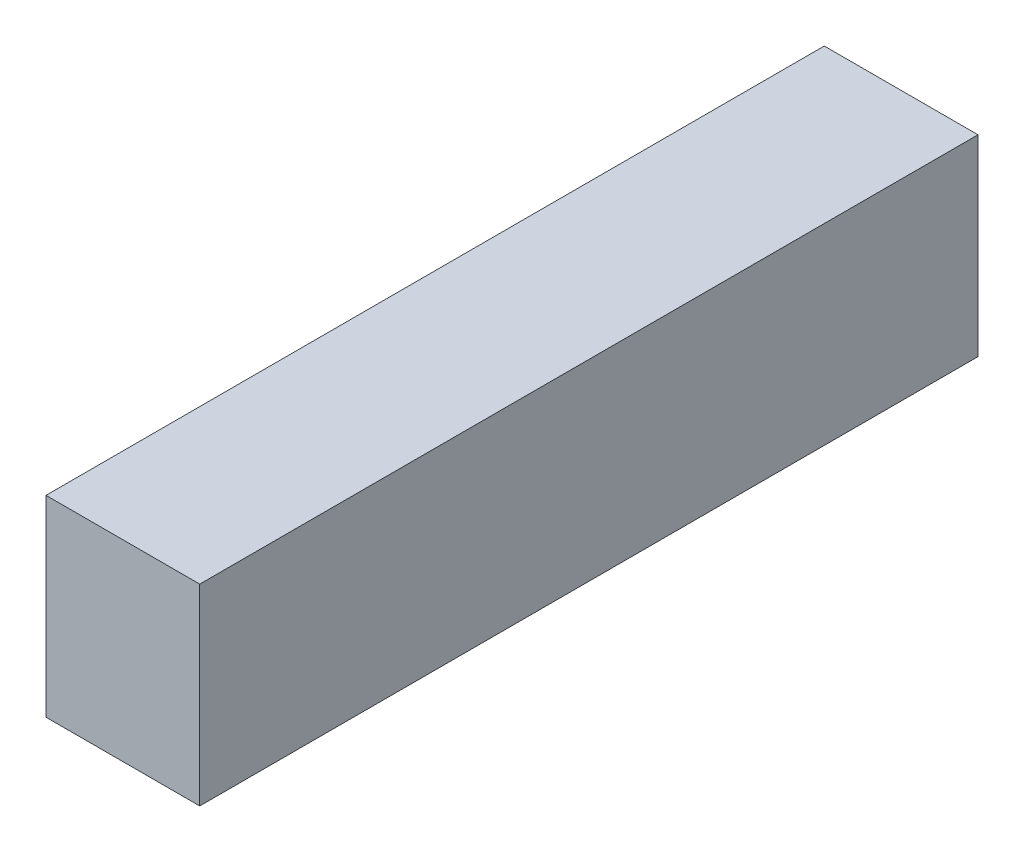
ISO-10303-21;
HEADER;
FILE_DESCRIPTION(('STEP AP214'),'2;1');
FILE_NAME('part.step','',(''),(''),'','','');
FILE_SCHEMA(('AUTOMOTIVE_DESIGN { 1 0 10303 214 1 1 1 1 }'));
ENDSEC;
DATA;
#1=APPLICATION_CONTEXT('core data for automotive mechanical design processes');
#2=APPLICATION_PROTOCOL_DEFINITION('international standard','automotive_design',2000,#1);
#3=PRODUCT_CONTEXT('',#1,'mechanical');
#4=PRODUCT('Part','Part','',(#3));
#5=PRODUCT_RELATED_PRODUCT_CATEGORY('part','',(#4));
#6=PRODUCT_DEFINITION_FORMATION('','',#4);
#7=PRODUCT_DEFINITION_CONTEXT('part definition',#1,'design');
#8=PRODUCT_DEFINITION('design','',#6,#7);
#9=PRODUCT_DEFINITION_SHAPE('','',#8);
#10=(LENGTH_UNIT() NAMED_UNIT(*) SI_UNIT(.MILLI.,.METRE.));
#11=(NAMED_UNIT(*) PLANE_ANGLE_UNIT() SI_UNIT($,.RADIAN.));
#12=(NAMED_UNIT(*) SI_UNIT($,.STERADIAN.) SOLID_ANGLE_UNIT());
#13=UNCERTAINTY_MEASURE_WITH_UNIT(LENGTH_MEASURE(1.E-05),#10,'distance_accuracy_value','');
#14=(GEOMETRIC_REPRESENTATION_CONTEXT(3) GLOBAL_UNCERTAINTY_ASSIGNED_CONTEXT((#13)) GLOBAL_UNIT_ASSIGNED_CONTEXT((#10,
#11,#12)) REPRESENTATION_CONTEXT('',''));
#15=CARTESIAN_POINT('',(0.,0.,0.));
#16=DIRECTION('',(0.,0.,1.));
#17=DIRECTION('',(1.,0.,0.));
#18=AXIS2_PLACEMENT_3D('',#15,#16,#17);
#19=CARTESIAN_POINT('',(160.,400.,810.));
#20=DIRECTION('',(-1.,0.,0.));
#21=DIRECTION('',(0.,0.,1.));
#22=AXIS2_PLACEMENT_3D('',#19,#20,#21);
#23=PLANE('',#22);
#24=DIRECTION('',(0.,0.,-1.));
#25=VECTOR('',#24,1.);
#26=CARTESIAN_POINT('',(160.,0.,810.));
#27=LINE('',#26,#25);
#28=CARTESIAN_POINT('',(160.,0.,810.));
#29=VERTEX_POINT('',#28);
#30=CARTESIAN_POINT('',(160.,0.,-810.));
#31=VERTEX_POINT('',#30);
#32=EDGE_CURVE('E102',#29,#31,#27,.T.);
#33=ORIENTED_EDGE('',*,*,#32,.T.);
#34=DIRECTION('',(0.,-1.,0.));
#35=VECTOR('',#34,1.);
#36=CARTESIAN_POINT('',(160.,400.,-810.));
#37=LINE('',#36,#35);
#38=CARTESIAN_POINT('',(160.,400.,-810.));
#39=VERTEX_POINT('',#38);
#40=EDGE_CURVE('E11',#39,#31,#37,.T.);
#41=ORIENTED_EDGE('',*,*,#40,.F.);
#42=DIRECTION('',(0.,0.,-1.));
#43=VECTOR('',#42,1.);
#44=CARTESIAN_POINT('',(160.,400.,810.));
#45=LINE('',#44,#43);
#46=CARTESIAN_POINT('',(160.,400.,810.));
#47=VERTEX_POINT('',#46);
#48=EDGE_CURVE('E95',#47,#39,#45,.T.);
#49=ORIENTED_EDGE('',*,*,#48,.F.);
#50=DIRECTION('',(0.,-1.,0.));
#51=VECTOR('',#50,1.);
#52=CARTESIAN_POINT('',(160.,400.,810.));
#53=LINE('',#52,#51);
#54=EDGE_CURVE('E99',#47,#29,#53,.T.);
#55=ORIENTED_EDGE('',*,*,#54,.T.);
#56=EDGE_LOOP('',(#33,#41,#49,#55));
#57=FACE_BOUND('',#56,.T.);
#58=ADVANCED_FACE('F41',(#57),#23,.F.);
#59=CARTESIAN_POINT('',(-160.,400.,-810.));
#60=DIRECTION('',(0.,0.,1.));
#61=DIRECTION('',(1.,0.,0.));
#62=AXIS2_PLACEMENT_3D('',#59,#60,#61);
#63=PLANE('',#62);
#64=DIRECTION('',(-1.,0.,0.));
#65=VECTOR('',#64,1.);
#66=CARTESIAN_POINT('',(-160.,0.,-810.));
#67=LINE('',#66,#65);
#68=CARTESIAN_POINT('',(-160.,0.,-810.));
#69=VERTEX_POINT('',#68);
#70=EDGE_CURVE('E96',#31,#69,#67,.T.);
#71=ORIENTED_EDGE('',*,*,#70,.T.);
#72=DIRECTION('',(0.,-1.,0.));
#73=VECTOR('',#72,1.);
#74=CARTESIAN_POINT('',(-160.,400.,-810.));
#75=LINE('',#74,#73);
#76=CARTESIAN_POINT('',(-160.,400.,-810.));
#77=VERTEX_POINT('',#76);
#78=EDGE_CURVE('E47',#77,#69,#75,.T.);
#79=ORIENTED_EDGE('',*,*,#78,.F.);
#80=DIRECTION('',(-1.,0.,0.));
#81=VECTOR('',#80,1.);
#82=CARTESIAN_POINT('',(-160.,400.,-810.));
#83=LINE('',#82,#81);
#84=EDGE_CURVE('E87',#39,#77,#83,.T.);
#85=ORIENTED_EDGE('',*,*,#84,.F.);
#86=ORIENTED_EDGE('',*,*,#40,.T.);
#87=EDGE_LOOP('',(#71,#79,#85,#86));
#88=FACE_BOUND('',#87,.T.);
#89=ADVANCED_FACE('F92',(#88),#63,.F.);
#90=CARTESIAN_POINT('',(-160.,400.,810.));
#91=DIRECTION('',(1.,0.,0.));
#92=DIRECTION('',(0.,0.,-1.));
#93=AXIS2_PLACEMENT_3D('',#90,#91,#92);
#94=PLANE('',#93);
#95=DIRECTION('',(0.,0.,1.));
#96=VECTOR('',#95,1.);
#97=CARTESIAN_POINT('',(-160.,0.,810.));
#98=LINE('',#97,#96);
#99=CARTESIAN_POINT('',(-160.,0.,810.));
#100=VERTEX_POINT('',#99);
#101=EDGE_CURVE('E74',#69,#100,#98,.T.);
#102=ORIENTED_EDGE('',*,*,#101,.T.);
#103=DIRECTION('',(0.,-1.,0.));
#104=VECTOR('',#103,1.);
#105=CARTESIAN_POINT('',(-160.,400.,810.));
#106=LINE('',#105,#104);
#107=CARTESIAN_POINT('',(-160.,400.,810.));
#108=VERTEX_POINT('',#107);
#109=EDGE_CURVE('E100',#108,#100,#106,.T.);
#110=ORIENTED_EDGE('',*,*,#109,.F.);
#111=DIRECTION('',(0.,0.,1.));
#112=VECTOR('',#111,1.);
#113=CARTESIAN_POINT('',(-160.,400.,810.));
#114=LINE('',#113,#112);
#115=EDGE_CURVE('E89',#77,#108,#114,.T.);
#116=ORIENTED_EDGE('',*,*,#115,.F.);
#117=ORIENTED_EDGE('',*,*,#78,.T.);
#118=EDGE_LOOP('',(#102,#110,#116,#117));
#119=FACE_BOUND('',#118,.T.);
#120=ADVANCED_FACE('F98',(#119),#94,.F.);
#121=CARTESIAN_POINT('',(-160.,400.,810.));
#122=DIRECTION('',(0.,0.,-1.));
#123=DIRECTION('',(-1.,0.,0.));
#124=AXIS2_PLACEMENT_3D('',#121,#122,#123);
#125=PLANE('',#124);
#126=DIRECTION('',(1.,0.,0.));
#127=VECTOR('',#126,1.);
#128=CARTESIAN_POINT('',(-160.,0.,810.));
#129=LINE('',#128,#127);
#130=EDGE_CURVE('E79',#100,#29,#129,.T.);
#131=ORIENTED_EDGE('',*,*,#130,.T.);
#132=ORIENTED_EDGE('',*,*,#54,.F.);
#133=DIRECTION('',(1.,0.,0.));
#134=VECTOR('',#133,1.);
#135=CARTESIAN_POINT('',(-160.,400.,810.));
#136=LINE('',#135,#134);
#137=EDGE_CURVE('E60',#108,#47,#136,.T.);
#138=ORIENTED_EDGE('',*,*,#137,.F.);
#139=ORIENTED_EDGE('',*,*,#109,.T.);
#140=EDGE_LOOP('',(#131,#132,#138,#139));
#141=FACE_BOUND('',#140,.T.);
#142=ADVANCED_FACE('F112',(#141),#125,.F.);
#143=CARTESIAN_POINT('',(0.,400.,0.));
#144=DIRECTION('',(0.,-1.,0.));
#145=DIRECTION('',(0.,0.,-1.));
#146=AXIS2_PLACEMENT_3D('',#143,#144,#145);
#147=PLANE('',#146);
#148=ORIENTED_EDGE('',*,*,#48,.T.);
#149=ORIENTED_EDGE('',*,*,#84,.T.);
#150=ORIENTED_EDGE('',*,*,#115,.T.);
#151=ORIENTED_EDGE('',*,*,#137,.T.);
#152=EDGE_LOOP('',(#148,#149,#150,#151));
#153=FACE_BOUND('',#152,.T.);
#154=ADVANCED_FACE('F86',(#153),#147,.F.);
#155=CARTESIAN_POINT('',(0.,0.,0.));
#156=DIRECTION('',(0.,-1.,0.));
#157=DIRECTION('',(0.,0.,-1.));
#158=AXIS2_PLACEMENT_3D('',#155,#156,#157);
#159=PLANE('',#158);
#160=ORIENTED_EDGE('',*,*,#32,.F.);
#161=ORIENTED_EDGE('',*,*,#130,.F.);
#162=ORIENTED_EDGE('',*,*,#101,.F.);
#163=ORIENTED_EDGE('',*,*,#70,.F.);
#164=EDGE_LOOP('',(#160,#161,#162,#163));
#165=FACE_BOUND('',#164,.T.);
#166=ADVANCED_FACE('F111',(#165),#159,.T.);
#167=CLOSED_SHELL('',(#58,#89,#120,#142,#154,#166));
#168=MANIFOLD_SOLID_BREP('B2',#167);
#169=ADVANCED_BREP_SHAPE_REPRESENTATION('',(#18,#168),#14);
#170=SHAPE_DEFINITION_REPRESENTATION(#9,#169);
ENDSEC;
END-ISO-10303-21;
